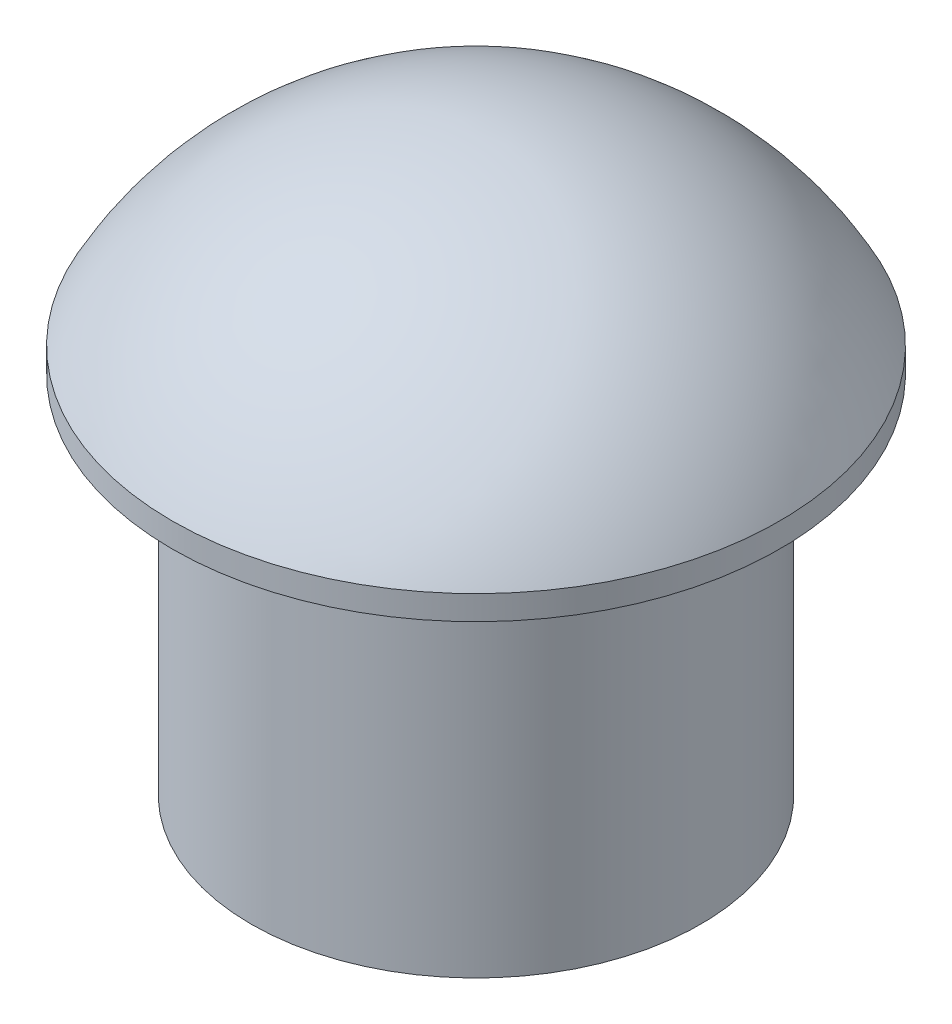
ISO-10303-21;
HEADER;
FILE_DESCRIPTION(('STEP AP214'),'2;1');
FILE_NAME('part.step','',(''),(''),'','','');
FILE_SCHEMA(('AUTOMOTIVE_DESIGN { 1 0 10303 214 1 1 1 1 }'));
ENDSEC;
DATA;
#1=APPLICATION_CONTEXT('core data for automotive mechanical design processes');
#2=APPLICATION_PROTOCOL_DEFINITION('international standard','automotive_design',2000,#1);
#3=PRODUCT_CONTEXT('',#1,'mechanical');
#4=PRODUCT('Part','Part','',(#3));
#5=PRODUCT_RELATED_PRODUCT_CATEGORY('part','',(#4));
#6=PRODUCT_DEFINITION_FORMATION('','',#4);
#7=PRODUCT_DEFINITION_CONTEXT('part definition',#1,'design');
#8=PRODUCT_DEFINITION('design','',#6,#7);
#9=PRODUCT_DEFINITION_SHAPE('','',#8);
#10=(LENGTH_UNIT() NAMED_UNIT(*) SI_UNIT(.MILLI.,.METRE.));
#11=(NAMED_UNIT(*) PLANE_ANGLE_UNIT() SI_UNIT($,.RADIAN.));
#12=(NAMED_UNIT(*) SI_UNIT($,.STERADIAN.) SOLID_ANGLE_UNIT());
#13=UNCERTAINTY_MEASURE_WITH_UNIT(LENGTH_MEASURE(1.E-05),#10,'distance_accuracy_value','');
#14=(GEOMETRIC_REPRESENTATION_CONTEXT(3) GLOBAL_UNCERTAINTY_ASSIGNED_CONTEXT((#13)) GLOBAL_UNIT_ASSIGNED_CONTEXT((#10,
#11,#12)) REPRESENTATION_CONTEXT('',''));
#15=CARTESIAN_POINT('',(0.,0.,0.));
#16=DIRECTION('',(0.,0.,1.));
#17=DIRECTION('',(1.,0.,0.));
#18=AXIS2_PLACEMENT_3D('',#15,#16,#17);
#19=CARTESIAN_POINT('',(0.,3.,0.));
#20=DIRECTION('',(0.,-1.,0.));
#21=DIRECTION('',(0.,0.,-1.));
#22=AXIS2_PLACEMENT_3D('',#19,#20,#21);
#23=CYLINDRICAL_SURFACE('',#22,1.85);
#24=CARTESIAN_POINT('',(0.,3.,0.));
#25=DIRECTION('',(0.,1.,0.));
#26=DIRECTION('',(0.,0.,1.));
#27=AXIS2_PLACEMENT_3D('',#24,#25,#26);
#28=CIRCLE('',#27,1.85);
#29=CARTESIAN_POINT('',(0.,3.,1.85));
#30=VERTEX_POINT('',#29);
#31=EDGE_CURVE('E10',#30,#30,#28,.T.);
#32=ORIENTED_EDGE('',*,*,#31,.F.);
#33=EDGE_LOOP('',(#32));
#34=FACE_BOUND('',#33,.T.);
#35=CARTESIAN_POINT('',(0.,0.,0.));
#36=DIRECTION('',(0.,1.,0.));
#37=DIRECTION('',(0.,0.,1.));
#38=AXIS2_PLACEMENT_3D('',#35,#36,#37);
#39=CIRCLE('',#38,1.85);
#40=CARTESIAN_POINT('',(0.,0.,1.85));
#41=VERTEX_POINT('',#40);
#42=EDGE_CURVE('E46',#41,#41,#39,.T.);
#43=ORIENTED_EDGE('',*,*,#42,.T.);
#44=EDGE_LOOP('',(#43));
#45=FACE_BOUND('',#44,.T.);
#46=ADVANCED_FACE('F37',(#34,#45),#23,.T.);
#47=CARTESIAN_POINT('',(0.,0.,0.));
#48=DIRECTION('',(0.,1.,0.));
#49=DIRECTION('',(0.,0.,1.));
#50=AXIS2_PLACEMENT_3D('',#47,#48,#49);
#51=PLANE('',#50);
#52=ORIENTED_EDGE('',*,*,#42,.F.);
#53=EDGE_LOOP('',(#52));
#54=FACE_BOUND('',#53,.T.);
#55=ADVANCED_FACE('F65',(#54),#51,.F.);
#56=CARTESIAN_POINT('',(0.,3.2,0.));
#57=DIRECTION('',(0.,-1.,0.));
#58=DIRECTION('',(0.,0.,-1.));
#59=AXIS2_PLACEMENT_3D('',#56,#57,#58);
#60=CYLINDRICAL_SURFACE('',#59,2.5);
#61=CARTESIAN_POINT('',(0.,3.2,0.));
#62=DIRECTION('',(0.,1.,0.));
#63=DIRECTION('',(0.,0.,1.));
#64=AXIS2_PLACEMENT_3D('',#61,#62,#63);
#65=CIRCLE('',#64,2.5);
#66=CARTESIAN_POINT('',(0.,3.2,2.5));
#67=VERTEX_POINT('',#66);
#68=EDGE_CURVE('E41',#67,#67,#65,.T.);
#69=ORIENTED_EDGE('',*,*,#68,.F.);
#70=EDGE_LOOP('',(#69));
#71=FACE_BOUND('',#70,.T.);
#72=CARTESIAN_POINT('',(0.,3.,0.));
#73=DIRECTION('',(0.,1.,0.));
#74=DIRECTION('',(0.,0.,1.));
#75=AXIS2_PLACEMENT_3D('',#72,#73,#74);
#76=CIRCLE('',#75,2.5);
#77=CARTESIAN_POINT('',(0.,3.,2.5));
#78=VERTEX_POINT('',#77);
#79=EDGE_CURVE('E53',#78,#78,#76,.T.);
#80=ORIENTED_EDGE('',*,*,#79,.T.);
#81=EDGE_LOOP('',(#80));
#82=FACE_BOUND('',#81,.T.);
#83=ADVANCED_FACE('F63',(#71,#82),#60,.T.);
#84=CARTESIAN_POINT('',(0.,1.86666666666667,0.));
#85=DIRECTION('',(0.,0.,1.));
#86=DIRECTION('',(1.,0.,0.));
#87=AXIS2_PLACEMENT_3D('',#84,#85,#86);
#88=SPHERICAL_SURFACE('',#87,2.83333333333333);
#89=CARTESIAN_POINT('',(0.,1.86666666666667,0.));
#90=DIRECTION('',(0.,1.,0.));
#91=DIRECTION('',(0.,0.,1.));
#92=AXIS2_PLACEMENT_3D('',#89,#90,#91);
#93=SPHERICAL_SURFACE('',#92,2.83333333333333);
#94=ORIENTED_EDGE('',*,*,#68,.T.);
#95=EDGE_LOOP('',(#94));
#96=FACE_BOUND('',#95,.T.);
#97=ADVANCED_FACE('F39',(#96),#93,.T.);
#98=CARTESIAN_POINT('',(0.,3.,0.));
#99=DIRECTION('',(0.,1.,0.));
#100=DIRECTION('',(0.,0.,1.));
#101=AXIS2_PLACEMENT_3D('',#98,#99,#100);
#102=PLANE('',#101);
#103=ORIENTED_EDGE('',*,*,#31,.T.);
#104=EDGE_LOOP('',(#103));
#105=FACE_BOUND('',#104,.T.);
#106=ORIENTED_EDGE('',*,*,#79,.F.);
#107=EDGE_LOOP('',(#106));
#108=FACE_BOUND('',#107,.T.);
#109=ADVANCED_FACE('F71',(#105,#108),#102,.F.);
#110=CLOSED_SHELL('',(#46,#55,#83,#97,#109));
#111=MANIFOLD_SOLID_BREP('B2',#110);
#112=ADVANCED_BREP_SHAPE_REPRESENTATION('',(#18,#111),#14);
#113=SHAPE_DEFINITION_REPRESENTATION(#9,#112);
ENDSEC;
END-ISO-10303-21;
